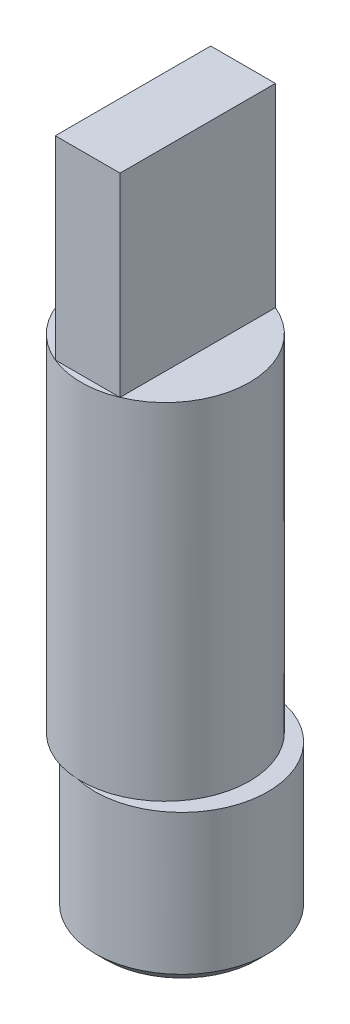
ISO-10303-21;
HEADER;
FILE_DESCRIPTION(('STEP AP214'),'2;1');
FILE_NAME('part.step','',(''),(''),'','','');
FILE_SCHEMA(('AUTOMOTIVE_DESIGN { 1 0 10303 214 1 1 1 1 }'));
ENDSEC;
DATA;
#1=APPLICATION_CONTEXT('core data for automotive mechanical design processes');
#2=APPLICATION_PROTOCOL_DEFINITION('international standard','automotive_design',2000,#1);
#3=PRODUCT_CONTEXT('',#1,'mechanical');
#4=PRODUCT('Part','Part','',(#3));
#5=PRODUCT_RELATED_PRODUCT_CATEGORY('part','',(#4));
#6=PRODUCT_DEFINITION_FORMATION('','',#4);
#7=PRODUCT_DEFINITION_CONTEXT('part definition',#1,'design');
#8=PRODUCT_DEFINITION('design','',#6,#7);
#9=PRODUCT_DEFINITION_SHAPE('','',#8);
#10=(LENGTH_UNIT() NAMED_UNIT(*) SI_UNIT(.MILLI.,.METRE.));
#11=(NAMED_UNIT(*) PLANE_ANGLE_UNIT() SI_UNIT($,.RADIAN.));
#12=(NAMED_UNIT(*) SI_UNIT($,.STERADIAN.) SOLID_ANGLE_UNIT());
#13=UNCERTAINTY_MEASURE_WITH_UNIT(LENGTH_MEASURE(1.E-05),#10,'distance_accuracy_value','');
#14=(GEOMETRIC_REPRESENTATION_CONTEXT(3) GLOBAL_UNCERTAINTY_ASSIGNED_CONTEXT((#13)) GLOBAL_UNIT_ASSIGNED_CONTEXT((#10,
#11,#12)) REPRESENTATION_CONTEXT('',''));
#15=CARTESIAN_POINT('',(0.,0.,0.));
#16=DIRECTION('',(0.,0.,1.));
#17=DIRECTION('',(1.,0.,0.));
#18=AXIS2_PLACEMENT_3D('',#15,#16,#17);
#19=CARTESIAN_POINT('',(-0.75,23.,0.));
#20=DIRECTION('',(0.,1.,0.));
#21=DIRECTION('',(0.,0.,1.));
#22=AXIS2_PLACEMENT_3D('',#19,#20,#21);
#23=PLANE('',#22);
#24=DIRECTION('',(0.,0.,-1.));
#25=VECTOR('',#24,1.);
#26=CARTESIAN_POINT('',(0.75,23.,-3.6));
#27=LINE('',#26,#25);
#28=CARTESIAN_POINT('',(0.749999999999998,23.,3.6));
#29=VERTEX_POINT('',#28);
#30=CARTESIAN_POINT('',(0.749999999999998,23.,-3.6));
#31=VERTEX_POINT('',#30);
#32=EDGE_CURVE('E115',#29,#31,#27,.T.);
#33=ORIENTED_EDGE('',*,*,#32,.F.);
#34=CARTESIAN_POINT('',(-0.75,23.,0.));
#35=DIRECTION('',(0.,1.,0.));
#36=DIRECTION('',(0.,0.,1.));
#37=AXIS2_PLACEMENT_3D('',#34,#35,#36);
#38=CIRCLE('',#37,3.9);
#39=EDGE_CURVE('E129',#29,#31,#38,.T.);
#40=ORIENTED_EDGE('',*,*,#39,.T.);
#41=EDGE_LOOP('',(#33,#40));
#42=FACE_BOUND('',#41,.T.);
#43=ADVANCED_FACE('F41',(#42),#23,.T.);
#44=DIRECTION('',(1.,0.,0.));
#45=VECTOR('',#44,1.);
#46=CARTESIAN_POINT('',(-2.25,23.,3.6));
#47=LINE('',#46,#45);
#48=CARTESIAN_POINT('',(-2.25,23.,3.6));
#49=VERTEX_POINT('',#48);
#50=EDGE_CURVE('E57',#49,#29,#47,.T.);
#51=ORIENTED_EDGE('',*,*,#50,.F.);
#52=EDGE_CURVE('E122',#49,#29,#38,.T.);
#53=ORIENTED_EDGE('',*,*,#52,.T.);
#54=EDGE_LOOP('',(#51,#53));
#55=FACE_BOUND('',#54,.T.);
#56=ADVANCED_FACE('F162',(#55),#23,.T.);
#57=DIRECTION('',(0.,0.,1.));
#58=VECTOR('',#57,1.);
#59=CARTESIAN_POINT('',(-2.25,23.,-3.6));
#60=LINE('',#59,#58);
#61=CARTESIAN_POINT('',(-2.25,23.,-3.6));
#62=VERTEX_POINT('',#61);
#63=EDGE_CURVE('E172',#62,#49,#60,.T.);
#64=ORIENTED_EDGE('',*,*,#63,.F.);
#65=EDGE_CURVE('E158',#62,#49,#38,.T.);
#66=ORIENTED_EDGE('',*,*,#65,.T.);
#67=EDGE_LOOP('',(#64,#66));
#68=FACE_BOUND('',#67,.T.);
#69=ADVANCED_FACE('F192',(#68),#23,.T.);
#70=CARTESIAN_POINT('',(0.,7.,0.));
#71=DIRECTION('',(0.,-1.,0.));
#72=DIRECTION('',(0.,0.,-1.));
#73=AXIS2_PLACEMENT_3D('',#70,#71,#72);
#74=CYLINDRICAL_SURFACE('',#73,4.);
#75=CARTESIAN_POINT('',(0.,0.500000000000007,0.));
#76=DIRECTION('',(0.,1.,0.));
#77=DIRECTION('',(0.,0.,1.));
#78=AXIS2_PLACEMENT_3D('',#75,#76,#77);
#79=CIRCLE('',#78,4.);
#80=CARTESIAN_POINT('',(0.,0.500000000000007,4.));
#81=VERTEX_POINT('',#80);
#82=EDGE_CURVE('E51',#81,#81,#79,.T.);
#83=ORIENTED_EDGE('',*,*,#82,.T.);
#84=EDGE_LOOP('',(#83));
#85=FACE_BOUND('',#84,.T.);
#86=CARTESIAN_POINT('',(0.,7.,0.));
#87=DIRECTION('',(0.,1.,0.));
#88=DIRECTION('',(0.,0.,1.));
#89=AXIS2_PLACEMENT_3D('',#86,#87,#88);
#90=CIRCLE('',#89,4.);
#91=CARTESIAN_POINT('',(-0.90166666666667,7.,-3.89704981007713));
#92=VERTEX_POINT('',#91);
#93=CARTESIAN_POINT('',(-0.90166666666667,7.,3.89704981007713));
#94=VERTEX_POINT('',#93);
#95=EDGE_CURVE('E135',#92,#94,#90,.T.);
#96=ORIENTED_EDGE('',*,*,#95,.F.);
#97=EDGE_CURVE('E132',#94,#92,#90,.T.);
#98=ORIENTED_EDGE('',*,*,#97,.F.);
#99=EDGE_LOOP('',(#96,#98));
#100=FACE_BOUND('',#99,.T.);
#101=ADVANCED_FACE('F153',(#85,#100),#74,.T.);
#102=CARTESIAN_POINT('',(0.,7.,0.));
#103=DIRECTION('',(0.,1.,0.));
#104=DIRECTION('',(0.,0.,1.));
#105=AXIS2_PLACEMENT_3D('',#102,#103,#104);
#106=PLANE('',#105);
#107=CARTESIAN_POINT('',(-0.75,7.,0.));
#108=DIRECTION('',(0.,1.,0.));
#109=DIRECTION('',(0.,0.,1.));
#110=AXIS2_PLACEMENT_3D('',#107,#108,#109);
#111=CIRCLE('',#110,3.9);
#112=EDGE_CURVE('E124',#94,#92,#111,.T.);
#113=ORIENTED_EDGE('',*,*,#112,.F.);
#114=ORIENTED_EDGE('',*,*,#97,.T.);
#115=EDGE_LOOP('',(#113,#114));
#116=FACE_BOUND('',#115,.T.);
#117=ADVANCED_FACE('F154',(#116),#106,.T.);
#118=CARTESIAN_POINT('',(0.,0.,0.));
#119=DIRECTION('',(0.,1.,0.));
#120=DIRECTION('',(0.,0.,1.));
#121=AXIS2_PLACEMENT_3D('',#118,#119,#120);
#122=PLANE('',#121);
#123=CARTESIAN_POINT('',(0.,0.,0.));
#124=DIRECTION('',(0.,1.,0.));
#125=DIRECTION('',(0.,0.,1.));
#126=AXIS2_PLACEMENT_3D('',#123,#124,#125);
#127=CIRCLE('',#126,3.49999999999999);
#128=CARTESIAN_POINT('',(0.,0.,3.49999999999999));
#129=VERTEX_POINT('',#128);
#130=EDGE_CURVE('E11',#129,#129,#127,.F.);
#131=ORIENTED_EDGE('',*,*,#130,.T.);
#132=EDGE_LOOP('',(#131));
#133=FACE_BOUND('',#132,.T.);
#134=ADVANCED_FACE('F282',(#133),#122,.F.);
#135=CARTESIAN_POINT('',(-0.75,7.,0.));
#136=DIRECTION('',(0.,1.,0.));
#137=DIRECTION('',(0.,0.,1.));
#138=AXIS2_PLACEMENT_3D('',#135,#136,#137);
#139=PLANE('',#138);
#140=EDGE_CURVE('E117',#92,#94,#111,.T.);
#141=ORIENTED_EDGE('',*,*,#140,.F.);
#142=ORIENTED_EDGE('',*,*,#95,.T.);
#143=EDGE_LOOP('',(#141,#142));
#144=FACE_BOUND('',#143,.T.);
#145=ADVANCED_FACE('F151',(#144),#139,.F.);
#146=CARTESIAN_POINT('',(-0.75,23.,0.));
#147=DIRECTION('',(0.,-1.,0.));
#148=DIRECTION('',(0.,0.,-1.));
#149=AXIS2_PLACEMENT_3D('',#146,#147,#148);
#150=CYLINDRICAL_SURFACE('',#149,3.9);
#151=ORIENTED_EDGE('',*,*,#39,.F.);
#152=ORIENTED_EDGE('',*,*,#52,.F.);
#153=ORIENTED_EDGE('',*,*,#65,.F.);
#154=EDGE_CURVE('E133',#31,#62,#38,.T.);
#155=ORIENTED_EDGE('',*,*,#154,.F.);
#156=EDGE_LOOP('',(#151,#152,#153,#155));
#157=FACE_BOUND('',#156,.T.);
#158=ORIENTED_EDGE('',*,*,#140,.T.);
#159=ORIENTED_EDGE('',*,*,#112,.T.);
#160=EDGE_LOOP('',(#158,#159));
#161=FACE_BOUND('',#160,.T.);
#162=ADVANCED_FACE('F146',(#157,#161),#150,.T.);
#163=DIRECTION('',(-1.,0.,0.));
#164=VECTOR('',#163,1.);
#165=CARTESIAN_POINT('',(-2.25,23.,-3.6));
#166=LINE('',#165,#164);
#167=EDGE_CURVE('E64',#31,#62,#166,.T.);
#168=ORIENTED_EDGE('',*,*,#167,.F.);
#169=ORIENTED_EDGE('',*,*,#154,.T.);
#170=EDGE_LOOP('',(#168,#169));
#171=FACE_BOUND('',#170,.T.);
#172=ADVANCED_FACE('F195',(#171),#23,.T.);
#173=CARTESIAN_POINT('',(0.,0.500000000000007,0.));
#174=DIRECTION('',(0.,1.,0.));
#175=DIRECTION('',(0.,0.,1.));
#176=AXIS2_PLACEMENT_3D('',#173,#174,#175);
#177=CONICAL_SURFACE('',#176,4.,0.78539816339745);
#178=ORIENTED_EDGE('',*,*,#130,.F.);
#179=EDGE_LOOP('',(#178));
#180=FACE_BOUND('',#179,.T.);
#181=ORIENTED_EDGE('',*,*,#82,.F.);
#182=EDGE_LOOP('',(#181));
#183=FACE_BOUND('',#182,.T.);
#184=ADVANCED_FACE('F44',(#180,#183),#177,.T.);
#185=CARTESIAN_POINT('',(0.75,32.,-3.6));
#186=DIRECTION('',(-1.,0.,0.));
#187=DIRECTION('',(0.,0.,1.));
#188=AXIS2_PLACEMENT_3D('',#185,#186,#187);
#189=PLANE('',#188);
#190=ORIENTED_EDGE('',*,*,#32,.T.);
#191=DIRECTION('',(0.,-1.,0.));
#192=VECTOR('',#191,1.);
#193=CARTESIAN_POINT('',(0.75,32.,-3.6));
#194=LINE('',#193,#192);
#195=CARTESIAN_POINT('',(0.75,32.,-3.6));
#196=VERTEX_POINT('',#195);
#197=EDGE_CURVE('E95',#196,#31,#194,.T.);
#198=ORIENTED_EDGE('',*,*,#197,.F.);
#199=DIRECTION('',(0.,0.,-1.));
#200=VECTOR('',#199,1.);
#201=CARTESIAN_POINT('',(0.75,32.,-3.6));
#202=LINE('',#201,#200);
#203=CARTESIAN_POINT('',(0.75,32.,3.6));
#204=VERTEX_POINT('',#203);
#205=EDGE_CURVE('E103',#204,#196,#202,.T.);
#206=ORIENTED_EDGE('',*,*,#205,.F.);
#207=DIRECTION('',(0.,-1.,0.));
#208=VECTOR('',#207,1.);
#209=CARTESIAN_POINT('',(0.75,32.,3.6));
#210=LINE('',#209,#208);
#211=EDGE_CURVE('E169',#204,#29,#210,.T.);
#212=ORIENTED_EDGE('',*,*,#211,.T.);
#213=EDGE_LOOP('',(#190,#198,#206,#212));
#214=FACE_BOUND('',#213,.T.);
#215=ADVANCED_FACE('F114',(#214),#189,.F.);
#216=CARTESIAN_POINT('',(-2.25,32.,-3.6));
#217=DIRECTION('',(0.,0.,1.));
#218=DIRECTION('',(1.,0.,0.));
#219=AXIS2_PLACEMENT_3D('',#216,#217,#218);
#220=PLANE('',#219);
#221=ORIENTED_EDGE('',*,*,#167,.T.);
#222=DIRECTION('',(0.,-1.,0.));
#223=VECTOR('',#222,1.);
#224=CARTESIAN_POINT('',(-2.25,32.,-3.6));
#225=LINE('',#224,#223);
#226=CARTESIAN_POINT('',(-2.25,32.,-3.6));
#227=VERTEX_POINT('',#226);
#228=EDGE_CURVE('E98',#227,#62,#225,.T.);
#229=ORIENTED_EDGE('',*,*,#228,.F.);
#230=DIRECTION('',(-1.,0.,0.));
#231=VECTOR('',#230,1.);
#232=CARTESIAN_POINT('',(-2.25,32.,-3.6));
#233=LINE('',#232,#231);
#234=EDGE_CURVE('E91',#196,#227,#233,.T.);
#235=ORIENTED_EDGE('',*,*,#234,.F.);
#236=ORIENTED_EDGE('',*,*,#197,.T.);
#237=EDGE_LOOP('',(#221,#229,#235,#236));
#238=FACE_BOUND('',#237,.T.);
#239=ADVANCED_FACE('F93',(#238),#220,.F.);
#240=CARTESIAN_POINT('',(-2.25,32.,-3.6));
#241=DIRECTION('',(1.,0.,0.));
#242=DIRECTION('',(0.,0.,-1.));
#243=AXIS2_PLACEMENT_3D('',#240,#241,#242);
#244=PLANE('',#243);
#245=ORIENTED_EDGE('',*,*,#63,.T.);
#246=DIRECTION('',(0.,-1.,0.));
#247=VECTOR('',#246,1.);
#248=CARTESIAN_POINT('',(-2.25,32.,3.6));
#249=LINE('',#248,#247);
#250=CARTESIAN_POINT('',(-2.25,32.,3.6));
#251=VERTEX_POINT('',#250);
#252=EDGE_CURVE('E125',#251,#49,#249,.T.);
#253=ORIENTED_EDGE('',*,*,#252,.F.);
#254=DIRECTION('',(0.,0.,1.));
#255=VECTOR('',#254,1.);
#256=CARTESIAN_POINT('',(-2.25,32.,-3.6));
#257=LINE('',#256,#255);
#258=EDGE_CURVE('E102',#227,#251,#257,.T.);
#259=ORIENTED_EDGE('',*,*,#258,.F.);
#260=ORIENTED_EDGE('',*,*,#228,.T.);
#261=EDGE_LOOP('',(#245,#253,#259,#260));
#262=FACE_BOUND('',#261,.T.);
#263=ADVANCED_FACE('F189',(#262),#244,.F.);
#264=CARTESIAN_POINT('',(-2.25,32.,3.6));
#265=DIRECTION('',(0.,0.,-1.));
#266=DIRECTION('',(-1.,0.,0.));
#267=AXIS2_PLACEMENT_3D('',#264,#265,#266);
#268=PLANE('',#267);
#269=ORIENTED_EDGE('',*,*,#50,.T.);
#270=ORIENTED_EDGE('',*,*,#211,.F.);
#271=DIRECTION('',(1.,0.,0.));
#272=VECTOR('',#271,1.);
#273=CARTESIAN_POINT('',(-2.25,32.,3.6));
#274=LINE('',#273,#272);
#275=EDGE_CURVE('E108',#251,#204,#274,.T.);
#276=ORIENTED_EDGE('',*,*,#275,.F.);
#277=ORIENTED_EDGE('',*,*,#252,.T.);
#278=EDGE_LOOP('',(#269,#270,#276,#277));
#279=FACE_BOUND('',#278,.T.);
#280=ADVANCED_FACE('F168',(#279),#268,.F.);
#281=CARTESIAN_POINT('',(0.,32.,0.));
#282=DIRECTION('',(0.,1.,0.));
#283=DIRECTION('',(0.,0.,1.));
#284=AXIS2_PLACEMENT_3D('',#281,#282,#283);
#285=PLANE('',#284);
#286=ORIENTED_EDGE('',*,*,#205,.T.);
#287=ORIENTED_EDGE('',*,*,#234,.T.);
#288=ORIENTED_EDGE('',*,*,#258,.T.);
#289=ORIENTED_EDGE('',*,*,#275,.T.);
#290=EDGE_LOOP('',(#286,#287,#288,#289));
#291=FACE_BOUND('',#290,.T.);
#292=ADVANCED_FACE('F106',(#291),#285,.T.);
#293=CLOSED_SHELL('',(#43,#56,#69,#101,#117,#134,#145,#162,#172,#184,#215,#239,#263,#280,#292));
#294=MANIFOLD_SOLID_BREP('B2',#293);
#295=ADVANCED_BREP_SHAPE_REPRESENTATION('',(#18,#294),#14);
#296=SHAPE_DEFINITION_REPRESENTATION(#9,#295);
ENDSEC;
END-ISO-10303-21;
